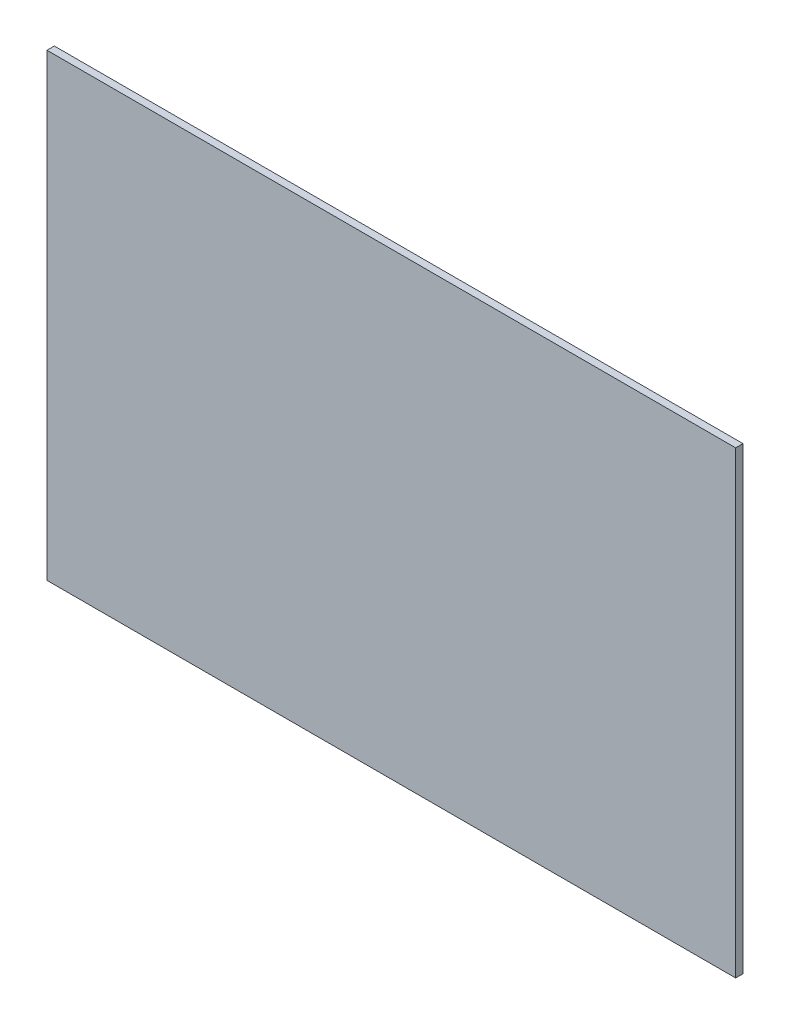
ISO-10303-21;
HEADER;
FILE_DESCRIPTION(('STEP AP214'),'2;1');
FILE_NAME('part.step','',(''),(''),'','','');
FILE_SCHEMA(('AUTOMOTIVE_DESIGN { 1 0 10303 214 1 1 1 1 }'));
ENDSEC;
DATA;
#1=APPLICATION_CONTEXT('core data for automotive mechanical design processes');
#2=APPLICATION_PROTOCOL_DEFINITION('international standard','automotive_design',2000,#1);
#3=PRODUCT_CONTEXT('',#1,'mechanical');
#4=PRODUCT('Part','Part','',(#3));
#5=PRODUCT_RELATED_PRODUCT_CATEGORY('part','',(#4));
#6=PRODUCT_DEFINITION_FORMATION('','',#4);
#7=PRODUCT_DEFINITION_CONTEXT('part definition',#1,'design');
#8=PRODUCT_DEFINITION('design','',#6,#7);
#9=PRODUCT_DEFINITION_SHAPE('','',#8);
#10=(LENGTH_UNIT() NAMED_UNIT(*) SI_UNIT(.MILLI.,.METRE.));
#11=(NAMED_UNIT(*) PLANE_ANGLE_UNIT() SI_UNIT($,.RADIAN.));
#12=(NAMED_UNIT(*) SI_UNIT($,.STERADIAN.) SOLID_ANGLE_UNIT());
#13=UNCERTAINTY_MEASURE_WITH_UNIT(LENGTH_MEASURE(1.E-05),#10,'distance_accuracy_value','');
#14=(GEOMETRIC_REPRESENTATION_CONTEXT(3) GLOBAL_UNCERTAINTY_ASSIGNED_CONTEXT((#13)) GLOBAL_UNIT_ASSIGNED_CONTEXT((#10,
#11,#12)) REPRESENTATION_CONTEXT('',''));
#15=CARTESIAN_POINT('',(0.,0.,0.));
#16=DIRECTION('',(0.,0.,1.));
#17=DIRECTION('',(1.,0.,0.));
#18=AXIS2_PLACEMENT_3D('',#15,#16,#17);
#19=CARTESIAN_POINT('',(-73.8944174376666,61.9928571428572,1.6));
#20=DIRECTION('',(1.,0.,0.));
#21=DIRECTION('',(0.,0.,-1.));
#22=AXIS2_PLACEMENT_3D('',#19,#20,#21);
#23=PLANE('',#22);
#24=DIRECTION('',(0.,-1.,0.));
#25=VECTOR('',#24,1.);
#26=CARTESIAN_POINT('',(-73.8944174376666,61.9928571428572,0.));
#27=LINE('',#26,#25);
#28=CARTESIAN_POINT('',(-73.8944174376666,61.9928571428572,0.));
#29=VERTEX_POINT('',#28);
#30=CARTESIAN_POINT('',(-73.8944174376666,-38.0071428571429,0.));
#31=VERTEX_POINT('',#30);
#32=EDGE_CURVE('E96',#29,#31,#27,.T.);
#33=ORIENTED_EDGE('',*,*,#32,.T.);
#34=DIRECTION('',(0.,0.,-1.));
#35=VECTOR('',#34,1.);
#36=CARTESIAN_POINT('',(-73.8944174376666,-38.0071428571429,1.6));
#37=LINE('',#36,#35);
#38=CARTESIAN_POINT('',(-73.8944174376666,-38.0071428571429,1.6));
#39=VERTEX_POINT('',#38);
#40=EDGE_CURVE('E11',#39,#31,#37,.T.);
#41=ORIENTED_EDGE('',*,*,#40,.F.);
#42=DIRECTION('',(0.,-1.,0.));
#43=VECTOR('',#42,1.);
#44=CARTESIAN_POINT('',(-73.8944174376666,61.9928571428572,1.6));
#45=LINE('',#44,#43);
#46=CARTESIAN_POINT('',(-73.8944174376666,61.9928571428572,1.6));
#47=VERTEX_POINT('',#46);
#48=EDGE_CURVE('E84',#47,#39,#45,.T.);
#49=ORIENTED_EDGE('',*,*,#48,.F.);
#50=DIRECTION('',(0.,0.,-1.));
#51=VECTOR('',#50,1.);
#52=CARTESIAN_POINT('',(-73.8944174376666,61.9928571428572,1.6));
#53=LINE('',#52,#51);
#54=EDGE_CURVE('E92',#47,#29,#53,.T.);
#55=ORIENTED_EDGE('',*,*,#54,.T.);
#56=EDGE_LOOP('',(#33,#41,#49,#55));
#57=FACE_BOUND('',#56,.T.);
#58=ADVANCED_FACE('F33',(#57),#23,.F.);
#59=CARTESIAN_POINT('',(-73.8944174376666,-38.0071428571429,1.6));
#60=DIRECTION('',(0.,1.,0.));
#61=DIRECTION('',(0.,0.,1.));
#62=AXIS2_PLACEMENT_3D('',#59,#60,#61);
#63=PLANE('',#62);
#64=DIRECTION('',(1.,0.,0.));
#65=VECTOR('',#64,1.);
#66=CARTESIAN_POINT('',(-73.8944174376666,-38.0071428571429,0.));
#67=LINE('',#66,#65);
#68=CARTESIAN_POINT('',(76.1055825623334,-38.0071428571429,0.));
#69=VERTEX_POINT('',#68);
#70=EDGE_CURVE('E88',#31,#69,#67,.T.);
#71=ORIENTED_EDGE('',*,*,#70,.T.);
#72=DIRECTION('',(0.,0.,-1.));
#73=VECTOR('',#72,1.);
#74=CARTESIAN_POINT('',(76.1055825623334,-38.0071428571429,1.6));
#75=LINE('',#74,#73);
#76=CARTESIAN_POINT('',(76.1055825623334,-38.0071428571429,1.6));
#77=VERTEX_POINT('',#76);
#78=EDGE_CURVE('E41',#77,#69,#75,.T.);
#79=ORIENTED_EDGE('',*,*,#78,.F.);
#80=DIRECTION('',(1.,0.,0.));
#81=VECTOR('',#80,1.);
#82=CARTESIAN_POINT('',(-73.8944174376666,-38.0071428571429,1.6));
#83=LINE('',#82,#81);
#84=EDGE_CURVE('E79',#39,#77,#83,.T.);
#85=ORIENTED_EDGE('',*,*,#84,.F.);
#86=ORIENTED_EDGE('',*,*,#40,.T.);
#87=EDGE_LOOP('',(#71,#79,#85,#86));
#88=FACE_BOUND('',#87,.T.);
#89=ADVANCED_FACE('F87',(#88),#63,.F.);
#90=CARTESIAN_POINT('',(76.1055825623334,61.9928571428572,1.6));
#91=DIRECTION('',(-1.,0.,0.));
#92=DIRECTION('',(0.,0.,1.));
#93=AXIS2_PLACEMENT_3D('',#90,#91,#92);
#94=PLANE('',#93);
#95=DIRECTION('',(0.,1.,0.));
#96=VECTOR('',#95,1.);
#97=CARTESIAN_POINT('',(76.1055825623334,61.9928571428572,0.));
#98=LINE('',#97,#96);
#99=CARTESIAN_POINT('',(76.1055825623334,61.9928571428572,0.));
#100=VERTEX_POINT('',#99);
#101=EDGE_CURVE('E66',#69,#100,#98,.T.);
#102=ORIENTED_EDGE('',*,*,#101,.T.);
#103=DIRECTION('',(0.,0.,-1.));
#104=VECTOR('',#103,1.);
#105=CARTESIAN_POINT('',(76.1055825623334,61.9928571428572,1.6));
#106=LINE('',#105,#104);
#107=CARTESIAN_POINT('',(76.1055825623334,61.9928571428572,1.6));
#108=VERTEX_POINT('',#107);
#109=EDGE_CURVE('E89',#108,#100,#106,.T.);
#110=ORIENTED_EDGE('',*,*,#109,.F.);
#111=DIRECTION('',(0.,1.,0.));
#112=VECTOR('',#111,1.);
#113=CARTESIAN_POINT('',(76.1055825623334,61.9928571428572,1.6));
#114=LINE('',#113,#112);
#115=EDGE_CURVE('E82',#77,#108,#114,.T.);
#116=ORIENTED_EDGE('',*,*,#115,.F.);
#117=ORIENTED_EDGE('',*,*,#78,.T.);
#118=EDGE_LOOP('',(#102,#110,#116,#117));
#119=FACE_BOUND('',#118,.T.);
#120=ADVANCED_FACE('F90',(#119),#94,.F.);
#121=CARTESIAN_POINT('',(-73.8944174376666,61.9928571428572,1.6));
#122=DIRECTION('',(0.,-1.,0.));
#123=DIRECTION('',(0.,0.,-1.));
#124=AXIS2_PLACEMENT_3D('',#121,#122,#123);
#125=PLANE('',#124);
#126=DIRECTION('',(-1.,0.,0.));
#127=VECTOR('',#126,1.);
#128=CARTESIAN_POINT('',(-73.8944174376666,61.9928571428572,0.));
#129=LINE('',#128,#127);
#130=EDGE_CURVE('E72',#100,#29,#129,.T.);
#131=ORIENTED_EDGE('',*,*,#130,.T.);
#132=ORIENTED_EDGE('',*,*,#54,.F.);
#133=DIRECTION('',(-1.,0.,0.));
#134=VECTOR('',#133,1.);
#135=CARTESIAN_POINT('',(-73.8944174376666,61.9928571428572,1.6));
#136=LINE('',#135,#134);
#137=EDGE_CURVE('E49',#108,#47,#136,.T.);
#138=ORIENTED_EDGE('',*,*,#137,.F.);
#139=ORIENTED_EDGE('',*,*,#109,.T.);
#140=EDGE_LOOP('',(#131,#132,#138,#139));
#141=FACE_BOUND('',#140,.T.);
#142=ADVANCED_FACE('F103',(#141),#125,.F.);
#143=CARTESIAN_POINT('',(0.,0.,1.6));
#144=DIRECTION('',(0.,0.,1.));
#145=DIRECTION('',(1.,0.,0.));
#146=AXIS2_PLACEMENT_3D('',#143,#144,#145);
#147=PLANE('',#146);
#148=ORIENTED_EDGE('',*,*,#48,.T.);
#149=ORIENTED_EDGE('',*,*,#84,.T.);
#150=ORIENTED_EDGE('',*,*,#115,.T.);
#151=ORIENTED_EDGE('',*,*,#137,.T.);
#152=EDGE_LOOP('',(#148,#149,#150,#151));
#153=FACE_BOUND('',#152,.T.);
#154=ADVANCED_FACE('F80',(#153),#147,.T.);
#155=CARTESIAN_POINT('',(0.,0.,0.));
#156=DIRECTION('',(0.,0.,1.));
#157=DIRECTION('',(1.,0.,0.));
#158=AXIS2_PLACEMENT_3D('',#155,#156,#157);
#159=PLANE('',#158);
#160=ORIENTED_EDGE('',*,*,#32,.F.);
#161=ORIENTED_EDGE('',*,*,#130,.F.);
#162=ORIENTED_EDGE('',*,*,#101,.F.);
#163=ORIENTED_EDGE('',*,*,#70,.F.);
#164=EDGE_LOOP('',(#160,#161,#162,#163));
#165=FACE_BOUND('',#164,.T.);
#166=ADVANCED_FACE('F106',(#165),#159,.F.);
#167=CLOSED_SHELL('',(#58,#89,#120,#142,#154,#166));
#168=MANIFOLD_SOLID_BREP('B2',#167);
#169=ADVANCED_BREP_SHAPE_REPRESENTATION('',(#18,#168),#14);
#170=SHAPE_DEFINITION_REPRESENTATION(#9,#169);
ENDSEC;
END-ISO-10303-21;
